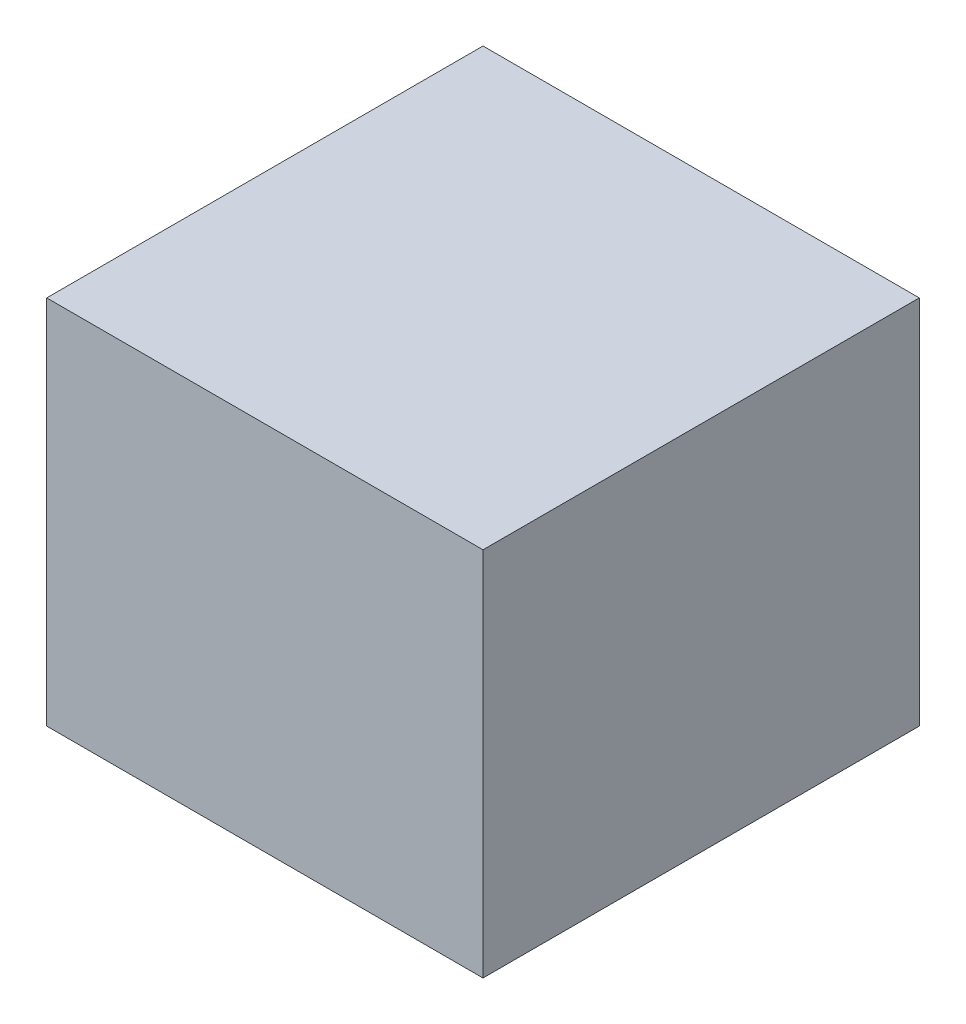
ISO-10303-21;
HEADER;
FILE_DESCRIPTION(('STEP AP214'),'2;1');
FILE_NAME('part.step','',(''),(''),'','','');
FILE_SCHEMA(('AUTOMOTIVE_DESIGN { 1 0 10303 214 1 1 1 1 }'));
ENDSEC;
DATA;
#1=APPLICATION_CONTEXT('core data for automotive mechanical design processes');
#2=APPLICATION_PROTOCOL_DEFINITION('international standard','automotive_design',2000,#1);
#3=PRODUCT_CONTEXT('',#1,'mechanical');
#4=PRODUCT('Part','Part','',(#3));
#5=PRODUCT_RELATED_PRODUCT_CATEGORY('part','',(#4));
#6=PRODUCT_DEFINITION_FORMATION('','',#4);
#7=PRODUCT_DEFINITION_CONTEXT('part definition',#1,'design');
#8=PRODUCT_DEFINITION('design','',#6,#7);
#9=PRODUCT_DEFINITION_SHAPE('','',#8);
#10=(LENGTH_UNIT() NAMED_UNIT(*) SI_UNIT(.MILLI.,.METRE.));
#11=(NAMED_UNIT(*) PLANE_ANGLE_UNIT() SI_UNIT($,.RADIAN.));
#12=(NAMED_UNIT(*) SI_UNIT($,.STERADIAN.) SOLID_ANGLE_UNIT());
#13=UNCERTAINTY_MEASURE_WITH_UNIT(LENGTH_MEASURE(1.E-05),#10,'distance_accuracy_value','');
#14=(GEOMETRIC_REPRESENTATION_CONTEXT(3) GLOBAL_UNCERTAINTY_ASSIGNED_CONTEXT((#13)) GLOBAL_UNIT_ASSIGNED_CONTEXT((#10,
#11,#12)) REPRESENTATION_CONTEXT('',''));
#15=CARTESIAN_POINT('',(0.,0.,0.));
#16=DIRECTION('',(0.,0.,1.));
#17=DIRECTION('',(1.,0.,0.));
#18=AXIS2_PLACEMENT_3D('',#15,#16,#17);
#19=CARTESIAN_POINT('',(13.208,86.36,0.));
#20=DIRECTION('',(0.,-1.,0.));
#21=DIRECTION('',(0.,0.,-1.));
#22=AXIS2_PLACEMENT_3D('',#19,#20,#21);
#23=PLANE('',#22);
#24=DIRECTION('',(0.,0.,-1.));
#25=VECTOR('',#24,1.);
#26=CARTESIAN_POINT('',(50.8,86.36,50.8));
#27=LINE('',#26,#25);
#28=CARTESIAN_POINT('',(50.8,86.36,50.8));
#29=VERTEX_POINT('',#28);
#30=CARTESIAN_POINT('',(50.8,86.36,-50.8));
#31=VERTEX_POINT('',#30);
#32=EDGE_CURVE('E48',#29,#31,#27,.T.);
#33=ORIENTED_EDGE('',*,*,#32,.T.);
#34=DIRECTION('',(-1.,0.,0.));
#35=VECTOR('',#34,1.);
#36=CARTESIAN_POINT('',(-50.8,86.36,-50.8));
#37=LINE('',#36,#35);
#38=CARTESIAN_POINT('',(-50.8,86.36,-50.8));
#39=VERTEX_POINT('',#38);
#40=EDGE_CURVE('E54',#31,#39,#37,.T.);
#41=ORIENTED_EDGE('',*,*,#40,.T.);
#42=DIRECTION('',(0.,0.,1.));
#43=VECTOR('',#42,1.);
#44=CARTESIAN_POINT('',(-50.8,86.36,50.8));
#45=LINE('',#44,#43);
#46=CARTESIAN_POINT('',(-50.8,86.36,50.8));
#47=VERTEX_POINT('',#46);
#48=EDGE_CURVE('E109',#39,#47,#45,.T.);
#49=ORIENTED_EDGE('',*,*,#48,.T.);
#50=DIRECTION('',(1.,0.,0.));
#51=VECTOR('',#50,1.);
#52=CARTESIAN_POINT('',(-50.8,86.36,50.8));
#53=LINE('',#52,#51);
#54=EDGE_CURVE('E11',#47,#29,#53,.T.);
#55=ORIENTED_EDGE('',*,*,#54,.T.);
#56=EDGE_LOOP('',(#33,#41,#49,#55));
#57=FACE_BOUND('',#56,.T.);
#58=ADVANCED_FACE('F39',(#57),#23,.F.);
#59=CARTESIAN_POINT('',(-50.8,240.204097937106,-50.8));
#60=DIRECTION('',(0.,0.,-1.));
#61=DIRECTION('',(-1.,0.,0.));
#62=AXIS2_PLACEMENT_3D('',#59,#60,#61);
#63=PLANE('',#62);
#64=ORIENTED_EDGE('',*,*,#40,.F.);
#65=DIRECTION('',(0.,-1.,0.));
#66=VECTOR('',#65,1.);
#67=CARTESIAN_POINT('',(50.8,240.204097937106,-50.8));
#68=LINE('',#67,#66);
#69=CARTESIAN_POINT('',(50.8,0.,-50.8));
#70=VERTEX_POINT('',#69);
#71=EDGE_CURVE('E107',#31,#70,#68,.T.);
#72=ORIENTED_EDGE('',*,*,#71,.T.);
#73=DIRECTION('',(1.,0.,0.));
#74=VECTOR('',#73,1.);
#75=CARTESIAN_POINT('',(-50.8,0.,-50.8));
#76=LINE('',#75,#74);
#77=CARTESIAN_POINT('',(-50.8,0.,-50.8));
#78=VERTEX_POINT('',#77);
#79=EDGE_CURVE('E85',#78,#70,#76,.T.);
#80=ORIENTED_EDGE('',*,*,#79,.F.);
#81=DIRECTION('',(0.,-1.,0.));
#82=VECTOR('',#81,1.);
#83=CARTESIAN_POINT('',(-50.8,240.204097937106,-50.8));
#84=LINE('',#83,#82);
#85=EDGE_CURVE('E110',#39,#78,#84,.T.);
#86=ORIENTED_EDGE('',*,*,#85,.F.);
#87=EDGE_LOOP('',(#64,#72,#80,#86));
#88=FACE_BOUND('',#87,.T.);
#89=ADVANCED_FACE('F116',(#88),#63,.T.);
#90=CARTESIAN_POINT('',(-50.8,240.204097937106,50.8));
#91=DIRECTION('',(-1.,0.,0.));
#92=DIRECTION('',(0.,0.,1.));
#93=AXIS2_PLACEMENT_3D('',#90,#91,#92);
#94=PLANE('',#93);
#95=ORIENTED_EDGE('',*,*,#48,.F.);
#96=ORIENTED_EDGE('',*,*,#85,.T.);
#97=DIRECTION('',(0.,0.,-1.));
#98=VECTOR('',#97,1.);
#99=CARTESIAN_POINT('',(-50.8,0.,50.8));
#100=LINE('',#99,#98);
#101=CARTESIAN_POINT('',(-50.8,0.,50.8));
#102=VERTEX_POINT('',#101);
#103=EDGE_CURVE('E93',#102,#78,#100,.T.);
#104=ORIENTED_EDGE('',*,*,#103,.F.);
#105=DIRECTION('',(0.,-1.,0.));
#106=VECTOR('',#105,1.);
#107=CARTESIAN_POINT('',(-50.8,240.204097937106,50.8));
#108=LINE('',#107,#106);
#109=EDGE_CURVE('E84',#47,#102,#108,.T.);
#110=ORIENTED_EDGE('',*,*,#109,.F.);
#111=EDGE_LOOP('',(#95,#96,#104,#110));
#112=FACE_BOUND('',#111,.T.);
#113=ADVANCED_FACE('F114',(#112),#94,.T.);
#114=CARTESIAN_POINT('',(-50.8,240.204097937106,50.8));
#115=DIRECTION('',(0.,0.,1.));
#116=DIRECTION('',(1.,0.,0.));
#117=AXIS2_PLACEMENT_3D('',#114,#115,#116);
#118=PLANE('',#117);
#119=ORIENTED_EDGE('',*,*,#54,.F.);
#120=ORIENTED_EDGE('',*,*,#109,.T.);
#121=DIRECTION('',(-1.,0.,0.));
#122=VECTOR('',#121,1.);
#123=CARTESIAN_POINT('',(-50.8,0.,50.8));
#124=LINE('',#123,#122);
#125=CARTESIAN_POINT('',(50.8,0.,50.8));
#126=VERTEX_POINT('',#125);
#127=EDGE_CURVE('E87',#126,#102,#124,.T.);
#128=ORIENTED_EDGE('',*,*,#127,.F.);
#129=DIRECTION('',(0.,-1.,0.));
#130=VECTOR('',#129,1.);
#131=CARTESIAN_POINT('',(50.8,240.204097937106,50.8));
#132=LINE('',#131,#130);
#133=EDGE_CURVE('E76',#29,#126,#132,.T.);
#134=ORIENTED_EDGE('',*,*,#133,.F.);
#135=EDGE_LOOP('',(#119,#120,#128,#134));
#136=FACE_BOUND('',#135,.T.);
#137=ADVANCED_FACE('F88',(#136),#118,.T.);
#138=CARTESIAN_POINT('',(50.8,240.204097937106,50.8));
#139=DIRECTION('',(1.,0.,0.));
#140=DIRECTION('',(0.,0.,-1.));
#141=AXIS2_PLACEMENT_3D('',#138,#139,#140);
#142=PLANE('',#141);
#143=ORIENTED_EDGE('',*,*,#32,.F.);
#144=ORIENTED_EDGE('',*,*,#133,.T.);
#145=DIRECTION('',(0.,0.,1.));
#146=VECTOR('',#145,1.);
#147=CARTESIAN_POINT('',(50.8,0.,50.8));
#148=LINE('',#147,#146);
#149=EDGE_CURVE('E80',#70,#126,#148,.T.);
#150=ORIENTED_EDGE('',*,*,#149,.F.);
#151=ORIENTED_EDGE('',*,*,#71,.F.);
#152=EDGE_LOOP('',(#143,#144,#150,#151));
#153=FACE_BOUND('',#152,.T.);
#154=ADVANCED_FACE('F41',(#153),#142,.T.);
#155=CARTESIAN_POINT('',(0.,0.,0.));
#156=DIRECTION('',(0.,-1.,0.));
#157=DIRECTION('',(0.,0.,-1.));
#158=AXIS2_PLACEMENT_3D('',#155,#156,#157);
#159=PLANE('',#158);
#160=CARTESIAN_POINT('',(0.,0.,0.));
#161=DIRECTION('',(0.,1.,0.));
#162=DIRECTION('',(0.,0.,1.));
#163=AXIS2_PLACEMENT_3D('',#160,#161,#162);
#164=CIRCLE('',#163,35.56);
#165=CARTESIAN_POINT('',(0.,0.,35.56));
#166=VERTEX_POINT('',#165);
#167=EDGE_CURVE('E145',#166,#166,#164,.F.);
#168=ORIENTED_EDGE('',*,*,#167,.F.);
#169=EDGE_LOOP('',(#168));
#170=FACE_BOUND('',#169,.T.);
#171=ORIENTED_EDGE('',*,*,#149,.T.);
#172=ORIENTED_EDGE('',*,*,#127,.T.);
#173=ORIENTED_EDGE('',*,*,#103,.T.);
#174=ORIENTED_EDGE('',*,*,#79,.T.);
#175=EDGE_LOOP('',(#171,#172,#173,#174));
#176=FACE_BOUND('',#175,.T.);
#177=ADVANCED_FACE('F95',(#170,#176),#159,.T.);
#178=CARTESIAN_POINT('',(0.,60.6579363383213,0.));
#179=DIRECTION('',(0.,1.,0.));
#180=DIRECTION('',(0.,0.,1.));
#181=AXIS2_PLACEMENT_3D('',#178,#179,#180);
#182=TOROIDAL_SURFACE('',#181,23.368,10.16);
#183=CARTESIAN_POINT('',(0.,60.6579363383213,0.));
#184=DIRECTION('',(0.,1.,0.));
#185=DIRECTION('',(0.,0.,1.));
#186=AXIS2_PLACEMENT_3D('',#183,#184,#185);
#187=CIRCLE('',#186,13.208);
#188=CARTESIAN_POINT('',(0.,60.6579363383213,13.208));
#189=VERTEX_POINT('',#188);
#190=EDGE_CURVE('E167',#189,#189,#187,.T.);
#191=ORIENTED_EDGE('',*,*,#190,.T.);
#192=EDGE_LOOP('',(#191));
#193=FACE_BOUND('',#192,.T.);
#194=CARTESIAN_POINT('',(0.,54.3893477857335,0.));
#195=DIRECTION('',(0.,1.,0.));
#196=DIRECTION('',(0.,0.,1.));
#197=AXIS2_PLACEMENT_3D('',#194,#195,#196);
#198=CIRCLE('',#197,15.372351335985);
#199=CARTESIAN_POINT('',(0.,54.3893477857335,15.372351335985));
#200=VERTEX_POINT('',#199);
#201=EDGE_CURVE('E164',#200,#200,#198,.T.);
#202=ORIENTED_EDGE('',*,*,#201,.F.);
#203=EDGE_LOOP('',(#202));
#204=FACE_BOUND('',#203,.T.);
#205=ADVANCED_FACE('F197',(#193,#204),#182,.T.);
#206=CARTESIAN_POINT('',(0.,76.2,0.));
#207=DIRECTION('',(0.,1.,0.));
#208=DIRECTION('',(0.,0.,1.));
#209=AXIS2_PLACEMENT_3D('',#206,#207,#208);
#210=CYLINDRICAL_SURFACE('',#209,13.208);
#211=CARTESIAN_POINT('',(0.,64.2062181691606,0.));
#212=DIRECTION('',(0.,-1.,0.));
#213=DIRECTION('',(0.,0.,-1.));
#214=AXIS2_PLACEMENT_3D('',#211,#212,#213);
#215=CIRCLE('',#214,13.208);
#216=CARTESIAN_POINT('',(0.,64.2062181691606,-13.208));
#217=VERTEX_POINT('',#216);
#218=EDGE_CURVE('E127',#217,#217,#215,.T.);
#219=ORIENTED_EDGE('',*,*,#218,.F.);
#220=EDGE_LOOP('',(#219));
#221=FACE_BOUND('',#220,.T.);
#222=ORIENTED_EDGE('',*,*,#190,.F.);
#223=EDGE_LOOP('',(#222));
#224=FACE_BOUND('',#223,.T.);
#225=ADVANCED_FACE('F204',(#221,#224),#210,.F.);
#226=CARTESIAN_POINT('',(0.,64.2062181691606,0.));
#227=DIRECTION('',(0.,-1.,0.));
#228=DIRECTION('',(0.,0.,-1.));
#229=AXIS2_PLACEMENT_3D('',#226,#227,#228);
#230=TOROIDAL_SURFACE('',#229,12.954,0.254);
#231=ORIENTED_EDGE('',*,*,#218,.T.);
#232=EDGE_LOOP('',(#231));
#233=FACE_BOUND('',#232,.T.);
#234=CARTESIAN_POINT('',(0.,64.4602181691606,0.));
#235=DIRECTION('',(0.,-1.,0.));
#236=DIRECTION('',(0.,0.,-1.));
#237=AXIS2_PLACEMENT_3D('',#234,#235,#236);
#238=CIRCLE('',#237,12.954);
#239=CARTESIAN_POINT('',(0.,64.4602181691606,-12.954));
#240=VERTEX_POINT('',#239);
#241=EDGE_CURVE('E130',#240,#240,#238,.F.);
#242=ORIENTED_EDGE('',*,*,#241,.T.);
#243=EDGE_LOOP('',(#242));
#244=FACE_BOUND('',#243,.T.);
#245=ADVANCED_FACE('F248',(#233,#244),#230,.F.);
#246=CARTESIAN_POINT('',(12.446,64.4602181691606,0.));
#247=DIRECTION('',(0.,-1.,0.));
#248=DIRECTION('',(0.,0.,-1.));
#249=AXIS2_PLACEMENT_3D('',#246,#247,#248);
#250=PLANE('',#249);
#251=ORIENTED_EDGE('',*,*,#241,.F.);
#252=EDGE_LOOP('',(#251));
#253=FACE_BOUND('',#252,.T.);
#254=CARTESIAN_POINT('',(0.,64.4602181691606,0.));
#255=DIRECTION('',(0.,1.,0.));
#256=DIRECTION('',(0.,0.,1.));
#257=AXIS2_PLACEMENT_3D('',#254,#255,#256);
#258=CIRCLE('',#257,12.446);
#259=CARTESIAN_POINT('',(0.,64.4602181691606,12.446));
#260=VERTEX_POINT('',#259);
#261=EDGE_CURVE('E170',#260,#260,#258,.T.);
#262=ORIENTED_EDGE('',*,*,#261,.T.);
#263=EDGE_LOOP('',(#262));
#264=FACE_BOUND('',#263,.T.);
#265=ADVANCED_FACE('F192',(#253,#264),#250,.T.);
#266=CARTESIAN_POINT('',(0.,76.2,0.));
#267=DIRECTION('',(0.,1.,0.));
#268=DIRECTION('',(0.,0.,1.));
#269=AXIS2_PLACEMENT_3D('',#266,#267,#268);
#270=CYLINDRICAL_SURFACE('',#269,12.446);
#271=CARTESIAN_POINT('',(0.,72.3977181691606,0.));
#272=DIRECTION('',(0.,1.,0.));
#273=DIRECTION('',(0.,0.,1.));
#274=AXIS2_PLACEMENT_3D('',#271,#272,#273);
#275=CIRCLE('',#274,12.446);
#276=CARTESIAN_POINT('',(0.,72.3977181691606,12.446));
#277=VERTEX_POINT('',#276);
#278=EDGE_CURVE('E173',#277,#277,#275,.T.);
#279=ORIENTED_EDGE('',*,*,#278,.T.);
#280=EDGE_LOOP('',(#279));
#281=FACE_BOUND('',#280,.T.);
#282=ORIENTED_EDGE('',*,*,#261,.F.);
#283=EDGE_LOOP('',(#282));
#284=FACE_BOUND('',#283,.T.);
#285=ADVANCED_FACE('F177',(#281,#284),#270,.F.);
#286=CARTESIAN_POINT('',(13.208,72.3977181691606,0.));
#287=DIRECTION('',(0.,1.,0.));
#288=DIRECTION('',(0.,0.,1.));
#289=AXIS2_PLACEMENT_3D('',#286,#287,#288);
#290=PLANE('',#289);
#291=CARTESIAN_POINT('',(0.,72.3977181691606,0.));
#292=DIRECTION('',(0.,1.,0.));
#293=DIRECTION('',(0.,0.,1.));
#294=AXIS2_PLACEMENT_3D('',#291,#292,#293);
#295=CIRCLE('',#294,12.954);
#296=CARTESIAN_POINT('',(0.,72.3977181691606,12.954));
#297=VERTEX_POINT('',#296);
#298=EDGE_CURVE('E133',#297,#297,#295,.F.);
#299=ORIENTED_EDGE('',*,*,#298,.F.);
#300=EDGE_LOOP('',(#299));
#301=FACE_BOUND('',#300,.T.);
#302=ORIENTED_EDGE('',*,*,#278,.F.);
#303=EDGE_LOOP('',(#302));
#304=FACE_BOUND('',#303,.T.);
#305=ADVANCED_FACE('F180',(#301,#304),#290,.T.);
#306=CARTESIAN_POINT('',(0.,72.6517181691606,0.));
#307=DIRECTION('',(0.,1.,0.));
#308=DIRECTION('',(0.,0.,1.));
#309=AXIS2_PLACEMENT_3D('',#306,#307,#308);
#310=TOROIDAL_SURFACE('',#309,12.954,0.254);
#311=ORIENTED_EDGE('',*,*,#298,.T.);
#312=EDGE_LOOP('',(#311));
#313=FACE_BOUND('',#312,.T.);
#314=CARTESIAN_POINT('',(0.,72.6517181691606,0.));
#315=DIRECTION('',(0.,1.,0.));
#316=DIRECTION('',(0.,0.,1.));
#317=AXIS2_PLACEMENT_3D('',#314,#315,#316);
#318=CIRCLE('',#317,13.208);
#319=CARTESIAN_POINT('',(0.,72.6517181691606,13.208));
#320=VERTEX_POINT('',#319);
#321=EDGE_CURVE('E136',#320,#320,#318,.T.);
#322=ORIENTED_EDGE('',*,*,#321,.T.);
#323=EDGE_LOOP('',(#322));
#324=FACE_BOUND('',#323,.T.);
#325=ADVANCED_FACE('F182',(#313,#324),#310,.F.);
#326=CARTESIAN_POINT('',(0.,76.2,0.));
#327=DIRECTION('',(0.,1.,0.));
#328=DIRECTION('',(0.,0.,1.));
#329=AXIS2_PLACEMENT_3D('',#326,#327,#328);
#330=CYLINDRICAL_SURFACE('',#329,13.208);
#331=ORIENTED_EDGE('',*,*,#321,.F.);
#332=EDGE_LOOP('',(#331));
#333=FACE_BOUND('',#332,.T.);
#334=CARTESIAN_POINT('',(0.,73.66,0.));
#335=DIRECTION('',(0.,-1.,0.));
#336=DIRECTION('',(0.,0.,-1.));
#337=AXIS2_PLACEMENT_3D('',#334,#335,#336);
#338=CIRCLE('',#337,13.208);
#339=CARTESIAN_POINT('',(0.,73.66,-13.208));
#340=VERTEX_POINT('',#339);
#341=EDGE_CURVE('E139',#340,#340,#338,.T.);
#342=ORIENTED_EDGE('',*,*,#341,.F.);
#343=EDGE_LOOP('',(#342));
#344=FACE_BOUND('',#343,.T.);
#345=ADVANCED_FACE('F189',(#333,#344),#330,.F.);
#346=CARTESIAN_POINT('',(0.,73.66,0.));
#347=DIRECTION('',(0.,-1.,0.));
#348=DIRECTION('',(0.,0.,-1.));
#349=AXIS2_PLACEMENT_3D('',#346,#347,#348);
#350=TOROIDAL_SURFACE('',#349,10.668,2.54);
#351=ORIENTED_EDGE('',*,*,#341,.T.);
#352=EDGE_LOOP('',(#351));
#353=FACE_BOUND('',#352,.T.);
#354=CARTESIAN_POINT('',(0.,76.2,0.));
#355=DIRECTION('',(0.,-1.,0.));
#356=DIRECTION('',(0.,0.,-1.));
#357=AXIS2_PLACEMENT_3D('',#354,#355,#356);
#358=CIRCLE('',#357,10.668);
#359=CARTESIAN_POINT('',(0.,76.2,-10.668));
#360=VERTEX_POINT('',#359);
#361=EDGE_CURVE('E142',#360,#360,#358,.F.);
#362=ORIENTED_EDGE('',*,*,#361,.T.);
#363=EDGE_LOOP('',(#362));
#364=FACE_BOUND('',#363,.T.);
#365=ADVANCED_FACE('F300',(#353,#364),#350,.F.);
#366=CARTESIAN_POINT('',(13.208,76.2,0.));
#367=DIRECTION('',(0.,-1.,0.));
#368=DIRECTION('',(0.,0.,-1.));
#369=AXIS2_PLACEMENT_3D('',#366,#367,#368);
#370=PLANE('',#369);
#371=ORIENTED_EDGE('',*,*,#361,.F.);
#372=EDGE_LOOP('',(#371));
#373=FACE_BOUND('',#372,.T.);
#374=ADVANCED_FACE('F310',(#373),#370,.T.);
#375=CARTESIAN_POINT('',(0.,28.1606522142665,0.));
#376=DIRECTION('',(0.,-1.,0.));
#377=DIRECTION('',(0.,0.,-1.));
#378=AXIS2_PLACEMENT_3D('',#375,#376,#377);
#379=CONICAL_SURFACE('',#378,35.935648664015,0.664908417409286);
#380=ORIENTED_EDGE('',*,*,#201,.T.);
#381=EDGE_LOOP('',(#380));
#382=FACE_BOUND('',#381,.T.);
#383=CARTESIAN_POINT('',(0.,28.1606522142665,0.));
#384=DIRECTION('',(0.,1.,0.));
#385=DIRECTION('',(0.,0.,1.));
#386=AXIS2_PLACEMENT_3D('',#383,#384,#385);
#387=CIRCLE('',#386,35.935648664015);
#388=CARTESIAN_POINT('',(0.,28.1606522142665,35.935648664015));
#389=VERTEX_POINT('',#388);
#390=EDGE_CURVE('E161',#389,#389,#387,.T.);
#391=ORIENTED_EDGE('',*,*,#390,.F.);
#392=EDGE_LOOP('',(#391));
#393=FACE_BOUND('',#392,.T.);
#394=ADVANCED_FACE('F322',(#382,#393),#379,.F.);
#395=CARTESIAN_POINT('',(0.,21.8920636616788,0.));
#396=DIRECTION('',(0.,1.,0.));
#397=DIRECTION('',(0.,0.,1.));
#398=AXIS2_PLACEMENT_3D('',#395,#396,#397);
#399=TOROIDAL_SURFACE('',#398,27.94,10.16);
#400=ORIENTED_EDGE('',*,*,#390,.T.);
#401=EDGE_LOOP('',(#400));
#402=FACE_BOUND('',#401,.T.);
#403=CARTESIAN_POINT('',(0.,21.8920636616788,0.));
#404=DIRECTION('',(0.,1.,0.));
#405=DIRECTION('',(0.,0.,1.));
#406=AXIS2_PLACEMENT_3D('',#403,#404,#405);
#407=CIRCLE('',#406,38.1);
#408=CARTESIAN_POINT('',(0.,21.8920636616788,38.1));
#409=VERTEX_POINT('',#408);
#410=EDGE_CURVE('E158',#409,#409,#407,.T.);
#411=ORIENTED_EDGE('',*,*,#410,.F.);
#412=EDGE_LOOP('',(#411));
#413=FACE_BOUND('',#412,.T.);
#414=ADVANCED_FACE('F334',(#402,#413),#399,.F.);
#415=CARTESIAN_POINT('',(0.,76.2,0.));
#416=DIRECTION('',(0.,1.,0.));
#417=DIRECTION('',(0.,0.,1.));
#418=AXIS2_PLACEMENT_3D('',#415,#416,#417);
#419=CYLINDRICAL_SURFACE('',#418,38.1);
#420=CARTESIAN_POINT('',(0.,15.1687818308394,0.));
#421=DIRECTION('',(0.,1.,0.));
#422=DIRECTION('',(0.,0.,1.));
#423=AXIS2_PLACEMENT_3D('',#420,#421,#422);
#424=CIRCLE('',#423,38.1);
#425=CARTESIAN_POINT('',(0.,15.1687818308394,38.1));
#426=VERTEX_POINT('',#425);
#427=EDGE_CURVE('E124',#426,#426,#424,.T.);
#428=ORIENTED_EDGE('',*,*,#427,.F.);
#429=EDGE_LOOP('',(#428));
#430=FACE_BOUND('',#429,.T.);
#431=ORIENTED_EDGE('',*,*,#410,.T.);
#432=EDGE_LOOP('',(#431));
#433=FACE_BOUND('',#432,.T.);
#434=ADVANCED_FACE('F345',(#430,#433),#419,.F.);
#435=CARTESIAN_POINT('',(0.,15.1687818308394,0.));
#436=DIRECTION('',(0.,1.,0.));
#437=DIRECTION('',(0.,0.,1.));
#438=AXIS2_PLACEMENT_3D('',#435,#436,#437);
#439=TOROIDAL_SURFACE('',#438,37.846,0.254);
#440=CARTESIAN_POINT('',(0.,14.9147818308394,0.));
#441=DIRECTION('',(0.,1.,0.));
#442=DIRECTION('',(0.,0.,1.));
#443=AXIS2_PLACEMENT_3D('',#440,#441,#442);
#444=CIRCLE('',#443,37.846);
#445=CARTESIAN_POINT('',(0.,14.9147818308394,37.846));
#446=VERTEX_POINT('',#445);
#447=EDGE_CURVE('E121',#446,#446,#444,.F.);
#448=ORIENTED_EDGE('',*,*,#447,.T.);
#449=EDGE_LOOP('',(#448));
#450=FACE_BOUND('',#449,.T.);
#451=ORIENTED_EDGE('',*,*,#427,.T.);
#452=EDGE_LOOP('',(#451));
#453=FACE_BOUND('',#452,.T.);
#454=ADVANCED_FACE('F356',(#450,#453),#439,.F.);
#455=CARTESIAN_POINT('',(38.1,14.9147818308394,0.));
#456=DIRECTION('',(0.,1.,0.));
#457=DIRECTION('',(0.,0.,1.));
#458=AXIS2_PLACEMENT_3D('',#455,#456,#457);
#459=PLANE('',#458);
#460=ORIENTED_EDGE('',*,*,#447,.F.);
#461=EDGE_LOOP('',(#460));
#462=FACE_BOUND('',#461,.T.);
#463=CARTESIAN_POINT('',(0.,14.9147818308394,0.));
#464=DIRECTION('',(0.,1.,0.));
#465=DIRECTION('',(0.,0.,1.));
#466=AXIS2_PLACEMENT_3D('',#463,#464,#465);
#467=CIRCLE('',#466,37.338);
#468=CARTESIAN_POINT('',(0.,14.9147818308394,37.338));
#469=VERTEX_POINT('',#468);
#470=EDGE_CURVE('E155',#469,#469,#467,.T.);
#471=ORIENTED_EDGE('',*,*,#470,.F.);
#472=EDGE_LOOP('',(#471));
#473=FACE_BOUND('',#472,.T.);
#474=ADVANCED_FACE('F367',(#462,#473),#459,.T.);
#475=CARTESIAN_POINT('',(0.,76.2,0.));
#476=DIRECTION('',(0.,1.,0.));
#477=DIRECTION('',(0.,0.,1.));
#478=AXIS2_PLACEMENT_3D('',#475,#476,#477);
#479=CYLINDRICAL_SURFACE('',#478,37.338);
#480=ORIENTED_EDGE('',*,*,#470,.T.);
#481=EDGE_LOOP('',(#480));
#482=FACE_BOUND('',#481,.T.);
#483=CARTESIAN_POINT('',(0.,6.97728183083939,0.));
#484=DIRECTION('',(0.,1.,0.));
#485=DIRECTION('',(0.,0.,1.));
#486=AXIS2_PLACEMENT_3D('',#483,#484,#485);
#487=CIRCLE('',#486,37.338);
#488=CARTESIAN_POINT('',(0.,6.97728183083939,37.338));
#489=VERTEX_POINT('',#488);
#490=EDGE_CURVE('E152',#489,#489,#487,.T.);
#491=ORIENTED_EDGE('',*,*,#490,.F.);
#492=EDGE_LOOP('',(#491));
#493=FACE_BOUND('',#492,.T.);
#494=ADVANCED_FACE('F378',(#482,#493),#479,.F.);
#495=CARTESIAN_POINT('',(37.338,6.97728183083938,0.));
#496=DIRECTION('',(0.,-1.,0.));
#497=DIRECTION('',(0.,0.,-1.));
#498=AXIS2_PLACEMENT_3D('',#495,#496,#497);
#499=PLANE('',#498);
#500=CARTESIAN_POINT('',(0.,6.97728183083938,0.));
#501=DIRECTION('',(0.,-1.,0.));
#502=DIRECTION('',(0.,0.,-1.));
#503=AXIS2_PLACEMENT_3D('',#500,#501,#502);
#504=CIRCLE('',#503,37.846);
#505=CARTESIAN_POINT('',(0.,6.97728183083938,-37.846));
#506=VERTEX_POINT('',#505);
#507=EDGE_CURVE('E100',#506,#506,#504,.F.);
#508=ORIENTED_EDGE('',*,*,#507,.F.);
#509=EDGE_LOOP('',(#508));
#510=FACE_BOUND('',#509,.T.);
#511=ORIENTED_EDGE('',*,*,#490,.T.);
#512=EDGE_LOOP('',(#511));
#513=FACE_BOUND('',#512,.T.);
#514=ADVANCED_FACE('F389',(#510,#513),#499,.T.);
#515=CARTESIAN_POINT('',(0.,6.72328183083938,0.));
#516=DIRECTION('',(0.,-1.,0.));
#517=DIRECTION('',(0.,0.,-1.));
#518=AXIS2_PLACEMENT_3D('',#515,#516,#517);
#519=TOROIDAL_SURFACE('',#518,37.846,0.254);
#520=CARTESIAN_POINT('',(0.,6.72328183083938,0.));
#521=DIRECTION('',(0.,-1.,0.));
#522=DIRECTION('',(0.,0.,-1.));
#523=AXIS2_PLACEMENT_3D('',#520,#521,#522);
#524=CIRCLE('',#523,38.1);
#525=CARTESIAN_POINT('',(0.,6.72328183083938,-38.1));
#526=VERTEX_POINT('',#525);
#527=EDGE_CURVE('E97',#526,#526,#524,.T.);
#528=ORIENTED_EDGE('',*,*,#527,.T.);
#529=EDGE_LOOP('',(#528));
#530=FACE_BOUND('',#529,.T.);
#531=ORIENTED_EDGE('',*,*,#507,.T.);
#532=EDGE_LOOP('',(#531));
#533=FACE_BOUND('',#532,.T.);
#534=ADVANCED_FACE('F400',(#530,#533),#519,.F.);
#535=CARTESIAN_POINT('',(0.,76.2,0.));
#536=DIRECTION('',(0.,1.,0.));
#537=DIRECTION('',(0.,0.,1.));
#538=AXIS2_PLACEMENT_3D('',#535,#536,#537);
#539=CYLINDRICAL_SURFACE('',#538,38.1);
#540=ORIENTED_EDGE('',*,*,#527,.F.);
#541=EDGE_LOOP('',(#540));
#542=FACE_BOUND('',#541,.T.);
#543=CARTESIAN_POINT('',(0.,2.54,0.));
#544=DIRECTION('',(0.,1.,0.));
#545=DIRECTION('',(0.,0.,1.));
#546=AXIS2_PLACEMENT_3D('',#543,#544,#545);
#547=CIRCLE('',#546,38.1);
#548=CARTESIAN_POINT('',(0.,2.54,38.1));
#549=VERTEX_POINT('',#548);
#550=EDGE_CURVE('E149',#549,#549,#547,.T.);
#551=ORIENTED_EDGE('',*,*,#550,.F.);
#552=EDGE_LOOP('',(#551));
#553=FACE_BOUND('',#552,.T.);
#554=ADVANCED_FACE('F411',(#542,#553),#539,.F.);
#555=CARTESIAN_POINT('',(0.,2.54,0.));
#556=DIRECTION('',(0.,1.,0.));
#557=DIRECTION('',(0.,0.,1.));
#558=AXIS2_PLACEMENT_3D('',#555,#556,#557);
#559=TOROIDAL_SURFACE('',#558,35.56,2.54);
#560=ORIENTED_EDGE('',*,*,#167,.T.);
#561=EDGE_LOOP('',(#560));
#562=FACE_BOUND('',#561,.T.);
#563=ORIENTED_EDGE('',*,*,#550,.T.);
#564=EDGE_LOOP('',(#563));
#565=FACE_BOUND('',#564,.T.);
#566=ADVANCED_FACE('F421',(#562,#565),#559,.F.);
#567=CLOSED_SHELL('',(#58,#89,#113,#137,#154,#177,#205,#225,#245,#265,#285,#305,#325,#345,#365,
#374,#394,#414,#434,#454,#474,#494,#514,#534,#554,#566));
#568=MANIFOLD_SOLID_BREP('B2',#567);
#569=ADVANCED_BREP_SHAPE_REPRESENTATION('',(#18,#568),#14);
#570=SHAPE_DEFINITION_REPRESENTATION(#9,#569);
ENDSEC;
END-ISO-10303-21;
